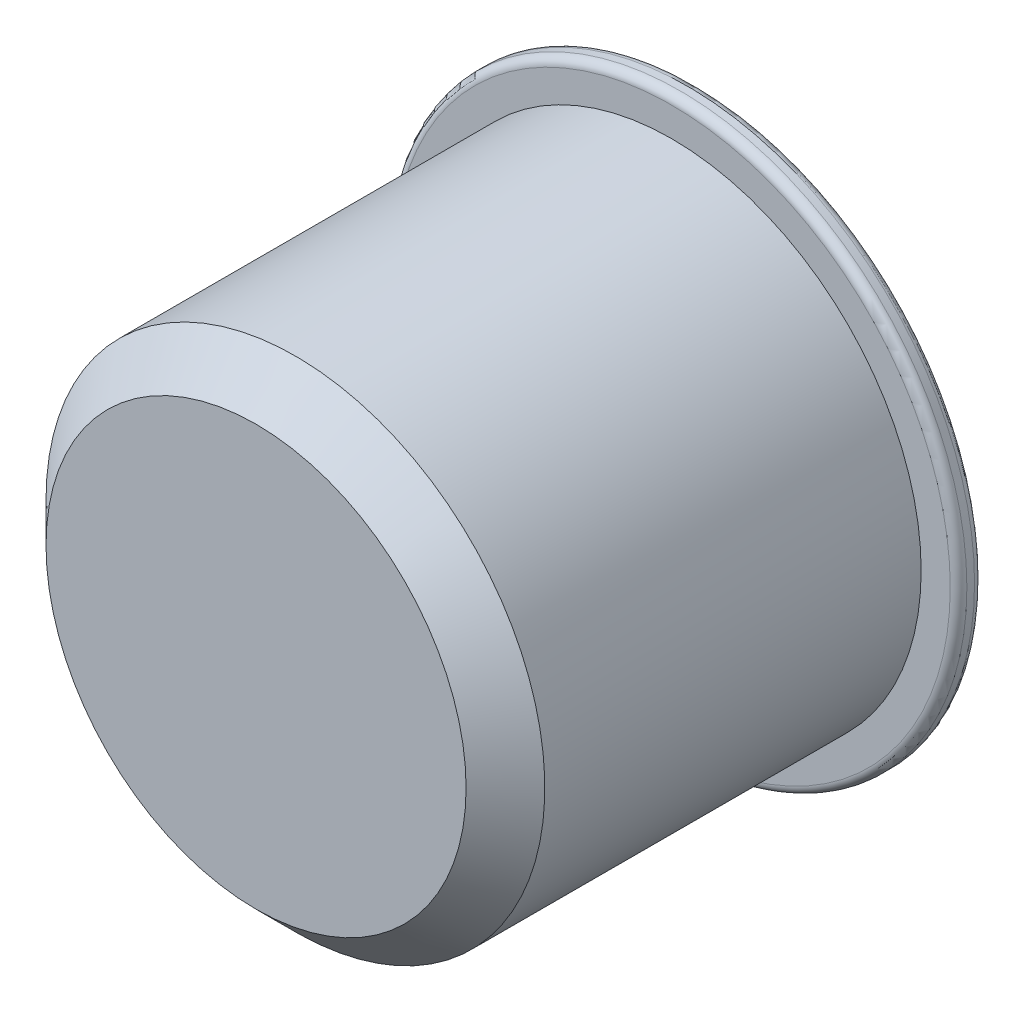
ISO-10303-21;
HEADER;
FILE_DESCRIPTION(('STEP AP214'),'2;1');
FILE_NAME('part.step','',(''),(''),'','','');
FILE_SCHEMA(('AUTOMOTIVE_DESIGN { 1 0 10303 214 1 1 1 1 }'));
ENDSEC;
DATA;
#1=APPLICATION_CONTEXT('core data for automotive mechanical design processes');
#2=APPLICATION_PROTOCOL_DEFINITION('international standard','automotive_design',2000,#1);
#3=PRODUCT_CONTEXT('',#1,'mechanical');
#4=PRODUCT('Part','Part','',(#3));
#5=PRODUCT_RELATED_PRODUCT_CATEGORY('part','',(#4));
#6=PRODUCT_DEFINITION_FORMATION('','',#4);
#7=PRODUCT_DEFINITION_CONTEXT('part definition',#1,'design');
#8=PRODUCT_DEFINITION('design','',#6,#7);
#9=PRODUCT_DEFINITION_SHAPE('','',#8);
#10=(LENGTH_UNIT() NAMED_UNIT(*) SI_UNIT(.MILLI.,.METRE.));
#11=(NAMED_UNIT(*) PLANE_ANGLE_UNIT() SI_UNIT($,.RADIAN.));
#12=(NAMED_UNIT(*) SI_UNIT($,.STERADIAN.) SOLID_ANGLE_UNIT());
#13=UNCERTAINTY_MEASURE_WITH_UNIT(LENGTH_MEASURE(1.E-05),#10,'distance_accuracy_value','');
#14=(GEOMETRIC_REPRESENTATION_CONTEXT(3) GLOBAL_UNCERTAINTY_ASSIGNED_CONTEXT((#13)) GLOBAL_UNIT_ASSIGNED_CONTEXT((#10,
#11,#12)) REPRESENTATION_CONTEXT('',''));
#15=CARTESIAN_POINT('',(0.,0.,0.));
#16=DIRECTION('',(0.,0.,1.));
#17=DIRECTION('',(1.,0.,0.));
#18=AXIS2_PLACEMENT_3D('',#15,#16,#17);
#19=CARTESIAN_POINT('',(0.,0.,1.6));
#20=DIRECTION('',(0.,0.,-1.));
#21=DIRECTION('',(-1.,0.,0.));
#22=AXIS2_PLACEMENT_3D('',#19,#20,#21);
#23=CYLINDRICAL_SURFACE('',#22,6.9);
#24=CARTESIAN_POINT('',(0.,0.,1.4));
#25=DIRECTION('',(0.,0.,1.));
#26=DIRECTION('',(1.,0.,0.));
#27=AXIS2_PLACEMENT_3D('',#24,#25,#26);
#28=CIRCLE('',#27,6.9);
#29=CARTESIAN_POINT('',(6.9,0.,1.4));
#30=VERTEX_POINT('',#29);
#31=EDGE_CURVE('E59',#30,#30,#28,.F.);
#32=ORIENTED_EDGE('',*,*,#31,.T.);
#33=EDGE_LOOP('',(#32));
#34=FACE_BOUND('',#33,.T.);
#35=CARTESIAN_POINT('',(0.,0.,1.21531050947474));
#36=DIRECTION('',(0.,0.,1.));
#37=DIRECTION('',(1.,0.,0.));
#38=AXIS2_PLACEMENT_3D('',#35,#36,#37);
#39=CIRCLE('',#38,6.9);
#40=CARTESIAN_POINT('',(6.9,0.,1.21531050947474));
#41=VERTEX_POINT('',#40);
#42=EDGE_CURVE('E308',#41,#41,#39,.T.);
#43=ORIENTED_EDGE('',*,*,#42,.T.);
#44=EDGE_LOOP('',(#43));
#45=FACE_BOUND('',#44,.T.);
#46=ADVANCED_FACE('F51',(#34,#45),#23,.T.);
#47=CARTESIAN_POINT('',(0.,0.,1.6));
#48=DIRECTION('',(0.,0.,1.));
#49=DIRECTION('',(1.,0.,0.));
#50=AXIS2_PLACEMENT_3D('',#47,#48,#49);
#51=PLANE('',#50);
#52=CARTESIAN_POINT('',(0.,0.,1.6));
#53=DIRECTION('',(0.,0.,1.));
#54=DIRECTION('',(1.,0.,0.));
#55=AXIS2_PLACEMENT_3D('',#52,#53,#54);
#56=CIRCLE('',#55,6.7);
#57=CARTESIAN_POINT('',(6.7,0.,1.6));
#58=VERTEX_POINT('',#57);
#59=EDGE_CURVE('E305',#58,#58,#56,.T.);
#60=ORIENTED_EDGE('',*,*,#59,.T.);
#61=EDGE_LOOP('',(#60));
#62=FACE_BOUND('',#61,.T.);
#63=CARTESIAN_POINT('',(0.,0.,1.6));
#64=DIRECTION('',(0.,0.,1.));
#65=DIRECTION('',(1.,0.,0.));
#66=AXIS2_PLACEMENT_3D('',#63,#64,#65);
#67=CIRCLE('',#66,6.);
#68=CARTESIAN_POINT('',(6.,0.,1.6));
#69=VERTEX_POINT('',#68);
#70=EDGE_CURVE('E288',#69,#69,#67,.T.);
#71=ORIENTED_EDGE('',*,*,#70,.F.);
#72=EDGE_LOOP('',(#71));
#73=FACE_BOUND('',#72,.T.);
#74=ADVANCED_FACE('F321',(#62,#73),#51,.T.);
#75=CARTESIAN_POINT('',(0.,0.,1.1));
#76=DIRECTION('',(0.,0.,1.));
#77=DIRECTION('',(1.,0.,0.));
#78=AXIS2_PLACEMENT_3D('',#75,#76,#77);
#79=CONICAL_SURFACE('',#78,6.9,1.04600055514479);
#80=CARTESIAN_POINT('',(0.,0.,1.04222525237851));
#81=DIRECTION('',(0.,0.,-1.));
#82=DIRECTION('',(-1.,0.,0.));
#83=AXIS2_PLACEMENT_3D('',#80,#81,#82);
#84=CIRCLE('',#83,6.80020725410834);
#85=CARTESIAN_POINT('',(-6.80020725410834,0.,1.04222525237851));
#86=VERTEX_POINT('',#85);
#87=EDGE_CURVE('E11',#86,#86,#84,.T.);
#88=ORIENTED_EDGE('',*,*,#87,.T.);
#89=EDGE_LOOP('',(#88));
#90=FACE_BOUND('',#89,.T.);
#91=CARTESIAN_POINT('',(0.,0.,0.));
#92=DIRECTION('',(0.,0.,-1.));
#93=DIRECTION('',(-1.,0.,0.));
#94=AXIS2_PLACEMENT_3D('',#91,#92,#93);
#95=CIRCLE('',#94,5.);
#96=CARTESIAN_POINT('',(-5.,0.,0.));
#97=VERTEX_POINT('',#96);
#98=EDGE_CURVE('E287',#97,#97,#95,.T.);
#99=ORIENTED_EDGE('',*,*,#98,.F.);
#100=EDGE_LOOP('',(#99));
#101=FACE_BOUND('',#100,.T.);
#102=ADVANCED_FACE('F324',(#90,#101),#79,.T.);
#103=CARTESIAN_POINT('',(0.,0.,0.));
#104=DIRECTION('',(0.,0.,1.));
#105=DIRECTION('',(1.,0.,0.));
#106=AXIS2_PLACEMENT_3D('',#103,#104,#105);
#107=PLANE('',#106);
#108=CARTESIAN_POINT('',(0.,0.,0.));
#109=DIRECTION('',(0.,0.,1.));
#110=DIRECTION('',(1.,0.,0.));
#111=AXIS2_PLACEMENT_3D('',#108,#109,#110);
#112=CIRCLE('',#111,4.6);
#113=CARTESIAN_POINT('',(4.6,0.,0.));
#114=VERTEX_POINT('',#113);
#115=EDGE_CURVE('E296',#114,#114,#112,.T.);
#116=ORIENTED_EDGE('',*,*,#115,.T.);
#117=EDGE_LOOP('',(#116));
#118=FACE_BOUND('',#117,.T.);
#119=ORIENTED_EDGE('',*,*,#98,.T.);
#120=EDGE_LOOP('',(#119));
#121=FACE_BOUND('',#120,.T.);
#122=ADVANCED_FACE('F331',(#118,#121),#107,.F.);
#123=CARTESIAN_POINT('',(0.,0.,11.6));
#124=DIRECTION('',(0.,0.,-1.));
#125=DIRECTION('',(-1.,0.,0.));
#126=AXIS2_PLACEMENT_3D('',#123,#124,#125);
#127=CYLINDRICAL_SURFACE('',#126,6.);
#128=CARTESIAN_POINT('',(0.,0.,10.653));
#129=DIRECTION('',(0.,0.,-1.));
#130=DIRECTION('',(-1.,0.,0.));
#131=AXIS2_PLACEMENT_3D('',#128,#129,#130);
#132=CIRCLE('',#131,6.);
#133=CARTESIAN_POINT('',(-6.,0.,10.653));
#134=VERTEX_POINT('',#133);
#135=EDGE_CURVE('E284',#134,#134,#132,.T.);
#136=ORIENTED_EDGE('',*,*,#135,.T.);
#137=EDGE_LOOP('',(#136));
#138=FACE_BOUND('',#137,.T.);
#139=ORIENTED_EDGE('',*,*,#70,.T.);
#140=EDGE_LOOP('',(#139));
#141=FACE_BOUND('',#140,.T.);
#142=ADVANCED_FACE('F328',(#138,#141),#127,.T.);
#143=CARTESIAN_POINT('',(0.,0.,11.6));
#144=DIRECTION('',(0.,0.,-1.));
#145=DIRECTION('',(-1.,0.,0.));
#146=AXIS2_PLACEMENT_3D('',#143,#144,#145);
#147=CONICAL_SURFACE('',#146,5.053,0.785398163397453);
#148=ORIENTED_EDGE('',*,*,#135,.F.);
#149=EDGE_LOOP('',(#148));
#150=FACE_BOUND('',#149,.T.);
#151=CARTESIAN_POINT('',(0.,0.,11.6));
#152=DIRECTION('',(0.,0.,-1.));
#153=DIRECTION('',(-1.,0.,0.));
#154=AXIS2_PLACEMENT_3D('',#151,#152,#153);
#155=CIRCLE('',#154,5.053);
#156=CARTESIAN_POINT('',(-5.053,0.,11.6));
#157=VERTEX_POINT('',#156);
#158=EDGE_CURVE('E281',#157,#157,#155,.T.);
#159=ORIENTED_EDGE('',*,*,#158,.T.);
#160=EDGE_LOOP('',(#159));
#161=FACE_BOUND('',#160,.T.);
#162=ADVANCED_FACE('F330',(#150,#161),#147,.T.);
#163=CARTESIAN_POINT('',(0.,0.,11.6));
#164=DIRECTION('',(0.,0.,1.));
#165=DIRECTION('',(1.,0.,0.));
#166=AXIS2_PLACEMENT_3D('',#163,#164,#165);
#167=PLANE('',#166);
#168=ORIENTED_EDGE('',*,*,#158,.F.);
#169=EDGE_LOOP('',(#168));
#170=FACE_BOUND('',#169,.T.);
#171=ADVANCED_FACE('F337',(#170),#167,.T.);
#172=CARTESIAN_POINT('',(0.,0.,0.5));
#173=DIRECTION('',(0.,0.,-1.));
#174=DIRECTION('',(-1.,0.,0.));
#175=AXIS2_PLACEMENT_3D('',#172,#173,#174);
#176=CYLINDRICAL_SURFACE('',#175,4.5);
#177=CARTESIAN_POINT('',(0.,0.,0.100000000000002));
#178=DIRECTION('',(0.,0.,1.));
#179=DIRECTION('',(1.,0.,0.));
#180=AXIS2_PLACEMENT_3D('',#177,#178,#179);
#181=CIRCLE('',#180,4.5);
#182=CARTESIAN_POINT('',(4.5,0.,0.100000000000002));
#183=VERTEX_POINT('',#182);
#184=EDGE_CURVE('E291',#183,#183,#181,.F.);
#185=ORIENTED_EDGE('',*,*,#184,.T.);
#186=EDGE_LOOP('',(#185));
#187=FACE_BOUND('',#186,.T.);
#188=CARTESIAN_POINT('',(0.,0.,0.5));
#189=DIRECTION('',(0.,0.,-1.));
#190=DIRECTION('',(-1.,0.,0.));
#191=AXIS2_PLACEMENT_3D('',#188,#189,#190);
#192=CIRCLE('',#191,4.5);
#193=CARTESIAN_POINT('',(-4.5,0.,0.5));
#194=VERTEX_POINT('',#193);
#195=EDGE_CURVE('E278',#194,#194,#192,.T.);
#196=ORIENTED_EDGE('',*,*,#195,.F.);
#197=EDGE_LOOP('',(#196));
#198=FACE_BOUND('',#197,.T.);
#199=ADVANCED_FACE('F385',(#187,#198),#176,.F.);
#200=CARTESIAN_POINT('',(0.,0.,0.5));
#201=DIRECTION('',(0.,0.,-1.));
#202=DIRECTION('',(-1.,0.,0.));
#203=AXIS2_PLACEMENT_3D('',#200,#201,#202);
#204=PLANE('',#203);
#205=CARTESIAN_POINT('',(0.,0.,0.5));
#206=DIRECTION('',(0.,0.,-1.));
#207=DIRECTION('',(-1.,0.,0.));
#208=AXIS2_PLACEMENT_3D('',#205,#206,#207);
#209=CIRCLE('',#208,3.5);
#210=CARTESIAN_POINT('',(-3.5,0.,0.5));
#211=VERTEX_POINT('',#210);
#212=EDGE_CURVE('E262',#211,#211,#209,.T.);
#213=ORIENTED_EDGE('',*,*,#212,.F.);
#214=EDGE_LOOP('',(#213));
#215=FACE_BOUND('',#214,.T.);
#216=ORIENTED_EDGE('',*,*,#195,.T.);
#217=EDGE_LOOP('',(#216));
#218=FACE_BOUND('',#217,.T.);
#219=ADVANCED_FACE('F378',(#215,#218),#204,.T.);
#220=CARTESIAN_POINT('',(0.,0.,0.5));
#221=DIRECTION('',(0.,0.,-1.));
#222=DIRECTION('',(-1.,0.,0.));
#223=AXIS2_PLACEMENT_3D('',#220,#221,#222);
#224=CYLINDRICAL_SURFACE('',#223,3.5);
#225=CARTESIAN_POINT('',(0.,0.,0.0999999999999977));
#226=DIRECTION('',(0.,0.,1.));
#227=DIRECTION('',(1.,0.,0.));
#228=AXIS2_PLACEMENT_3D('',#225,#226,#227);
#229=CIRCLE('',#228,3.5);
#230=CARTESIAN_POINT('',(3.5,0.,0.0999999999999977));
#231=VERTEX_POINT('',#230);
#232=EDGE_CURVE('E302',#231,#231,#229,.T.);
#233=ORIENTED_EDGE('',*,*,#232,.T.);
#234=EDGE_LOOP('',(#233));
#235=FACE_BOUND('',#234,.T.);
#236=ORIENTED_EDGE('',*,*,#212,.T.);
#237=EDGE_LOOP('',(#236));
#238=FACE_BOUND('',#237,.T.);
#239=ADVANCED_FACE('F371',(#235,#238),#224,.T.);
#240=CARTESIAN_POINT('',(0.,0.,0.));
#241=DIRECTION('',(0.,0.,1.));
#242=DIRECTION('',(1.,0.,0.));
#243=AXIS2_PLACEMENT_3D('',#240,#241,#242);
#244=CIRCLE('',#243,3.4);
#245=CARTESIAN_POINT('',(3.4,0.,0.));
#246=VERTEX_POINT('',#245);
#247=EDGE_CURVE('E299',#246,#246,#244,.F.);
#248=ORIENTED_EDGE('',*,*,#247,.T.);
#249=EDGE_LOOP('',(#248));
#250=FACE_BOUND('',#249,.T.);
#251=DIRECTION('',(0.584534969072463,-0.811368516724339,0.));
#252=VECTOR('',#251,1.);
#253=CARTESIAN_POINT('',(-1.32058244355751,1.83304519854762,0.));
#254=LINE('',#253,#252);
#255=CARTESIAN_POINT('',(-1.37925483630834,1.9144858903756,0.));
#256=VERTEX_POINT('',#255);
#257=CARTESIAN_POINT('',(-1.32058244355751,1.83304519854762,0.));
#258=VERTEX_POINT('',#257);
#259=EDGE_CURVE('E185',#256,#258,#254,.T.);
#260=ORIENTED_EDGE('',*,*,#259,.F.);
#261=CARTESIAN_POINT('',(-1.5415285396532,1.7975788965611,0.));
#262=DIRECTION('',(0.,0.,-1.));
#263=DIRECTION('',(1.,0.,0.));
#264=AXIS2_PLACEMENT_3D('',#261,#262,#263);
#265=CIRCLE('',#264,0.200000000000001);
#266=CARTESIAN_POINT('',(-1.67172316217779,1.9493990542006,0.));
#267=VERTEX_POINT('',#266);
#268=EDGE_CURVE('E66',#267,#256,#265,.T.);
#269=ORIENTED_EDGE('',*,*,#268,.F.);
#270=CARTESIAN_POINT('',(0.,0.,0.));
#271=DIRECTION('',(0.,0.,-1.));
#272=DIRECTION('',(-1.,0.,0.));
#273=AXIS2_PLACEMENT_3D('',#270,#271,#272);
#274=CIRCLE('',#273,2.56803718888179);
#275=CARTESIAN_POINT('',(1.67172316217779,1.9493990542006,0.));
#276=VERTEX_POINT('',#275);
#277=EDGE_CURVE('E173',#276,#267,#274,.T.);
#278=ORIENTED_EDGE('',*,*,#277,.F.);
#279=CARTESIAN_POINT('',(1.5415285396532,1.7975788965611,0.));
#280=DIRECTION('',(0.,0.,-1.));
#281=DIRECTION('',(-1.,0.,0.));
#282=AXIS2_PLACEMENT_3D('',#279,#280,#281);
#283=CIRCLE('',#282,0.2);
#284=CARTESIAN_POINT('',(1.37925483630834,1.9144858903756,0.));
#285=VERTEX_POINT('',#284);
#286=EDGE_CURVE('E178',#285,#276,#283,.T.);
#287=ORIENTED_EDGE('',*,*,#286,.F.);
#288=DIRECTION('',(0.584534969072464,0.811368516724339,0.));
#289=VECTOR('',#288,1.);
#290=CARTESIAN_POINT('',(1.32058244355751,1.83304519854762,0.));
#291=LINE('',#290,#289);
#292=CARTESIAN_POINT('',(1.32058244355751,1.83304519854762,0.));
#293=VERTEX_POINT('',#292);
#294=EDGE_CURVE('E672',#293,#285,#291,.T.);
#295=ORIENTED_EDGE('',*,*,#294,.F.);
#296=CARTESIAN_POINT('',(1.48285614690238,1.71613820473313,0.));
#297=DIRECTION('',(0.,0.,-1.));
#298=DIRECTION('',(-1.,0.,0.));
#299=AXIS2_PLACEMENT_3D('',#296,#297,#298);
#300=CIRCLE('',#299,0.2);
#301=CARTESIAN_POINT('',(1.35209496237053,1.56480574747486,0.));
#302=VERTEX_POINT('',#301);
#303=EDGE_CURVE('E674',#302,#293,#300,.T.);
#304=ORIENTED_EDGE('',*,*,#303,.F.);
#305=CARTESIAN_POINT('',(0.,0.,0.));
#306=DIRECTION('',(0.,0.,1.));
#307=DIRECTION('',(-1.,0.,0.));
#308=AXIS2_PLACEMENT_3D('',#305,#306,#307);
#309=CIRCLE('',#308,2.06803718888179);
#310=CARTESIAN_POINT('',(-1.35209496237053,1.56480574747486,0.));
#311=VERTEX_POINT('',#310);
#312=EDGE_CURVE('E677',#311,#302,#309,.T.);
#313=ORIENTED_EDGE('',*,*,#312,.F.);
#314=CARTESIAN_POINT('',(-1.48285614690238,1.71613820473313,0.));
#315=DIRECTION('',(0.,0.,-1.));
#316=DIRECTION('',(1.,0.,0.));
#317=AXIS2_PLACEMENT_3D('',#314,#315,#316);
#318=CIRCLE('',#317,0.2);
#319=EDGE_CURVE('E189',#258,#311,#318,.T.);
#320=ORIENTED_EDGE('',*,*,#319,.F.);
#321=EDGE_LOOP('',(#260,#269,#278,#287,#295,#304,#313,#320));
#322=FACE_BOUND('',#321,.T.);
#323=DIRECTION('',(1.,0.,0.));
#324=VECTOR('',#323,1.);
#325=CARTESIAN_POINT('',(-0.0501872393057397,2.75880472339706,0.));
#326=LINE('',#325,#324);
#327=CARTESIAN_POINT('',(-0.0501872393057397,2.75880472339706,0.));
#328=VERTEX_POINT('',#327);
#329=CARTESIAN_POINT('',(0.0501872393057394,2.75880472339706,0.));
#330=VERTEX_POINT('',#329);
#331=EDGE_CURVE('E187',#328,#330,#326,.T.);
#332=ORIENTED_EDGE('',*,*,#331,.F.);
#333=CARTESIAN_POINT('',(-0.0501872393057397,2.55880472339706,0.));
#334=DIRECTION('',(0.,0.,-1.));
#335=DIRECTION('',(-1.,0.,0.));
#336=AXIS2_PLACEMENT_3D('',#333,#334,#335);
#337=CIRCLE('',#336,0.2);
#338=CARTESIAN_POINT('',(-0.25018723930574,2.55880472339706,0.));
#339=VERTEX_POINT('',#338);
#340=EDGE_CURVE('E74',#339,#328,#337,.T.);
#341=ORIENTED_EDGE('',*,*,#340,.F.);
#342=DIRECTION('',(0.,1.,0.));
#343=VECTOR('',#342,1.);
#344=CARTESIAN_POINT('',(-0.25018723930574,1.48079356072704,0.));
#345=LINE('',#344,#343);
#346=CARTESIAN_POINT('',(-0.25018723930574,1.48079356072704,0.));
#347=VERTEX_POINT('',#346);
#348=EDGE_CURVE('E219',#347,#339,#345,.T.);
#349=ORIENTED_EDGE('',*,*,#348,.F.);
#350=CARTESIAN_POINT('',(-0.0501872393057397,1.48079356072704,0.));
#351=DIRECTION('',(0.,0.,-1.));
#352=DIRECTION('',(-1.,0.,0.));
#353=AXIS2_PLACEMENT_3D('',#350,#351,#352);
#354=CIRCLE('',#353,0.2);
#355=CARTESIAN_POINT('',(-0.0501872393057397,1.28079356072704,0.));
#356=VERTEX_POINT('',#355);
#357=EDGE_CURVE('E255',#356,#347,#354,.T.);
#358=ORIENTED_EDGE('',*,*,#357,.F.);
#359=DIRECTION('',(-1.,0.,0.));
#360=VECTOR('',#359,1.);
#361=CARTESIAN_POINT('',(0.0501872393057391,1.28079356072704,0.));
#362=LINE('',#361,#360);
#363=CARTESIAN_POINT('',(0.0501872393057391,1.28079356072704,0.));
#364=VERTEX_POINT('',#363);
#365=EDGE_CURVE('E252',#364,#356,#362,.T.);
#366=ORIENTED_EDGE('',*,*,#365,.F.);
#367=CARTESIAN_POINT('',(0.0501872393057391,1.48079356072704,0.));
#368=DIRECTION('',(0.,0.,-1.));
#369=DIRECTION('',(-1.,0.,0.));
#370=AXIS2_PLACEMENT_3D('',#367,#368,#369);
#371=CIRCLE('',#370,0.2);
#372=CARTESIAN_POINT('',(0.250187239305739,1.48079356072704,0.));
#373=VERTEX_POINT('',#372);
#374=EDGE_CURVE('E249',#373,#364,#371,.T.);
#375=ORIENTED_EDGE('',*,*,#374,.F.);
#376=DIRECTION('',(0.,-1.,0.));
#377=VECTOR('',#376,1.);
#378=CARTESIAN_POINT('',(0.250187239305739,1.48079356072704,0.));
#379=LINE('',#378,#377);
#380=CARTESIAN_POINT('',(0.250187239305739,2.55880472339706,0.));
#381=VERTEX_POINT('',#380);
#382=EDGE_CURVE('E246',#381,#373,#379,.T.);
#383=ORIENTED_EDGE('',*,*,#382,.F.);
#384=CARTESIAN_POINT('',(0.0501872393057393,2.55880472339706,0.));
#385=DIRECTION('',(0.,0.,-1.));
#386=DIRECTION('',(1.,0.,0.));
#387=AXIS2_PLACEMENT_3D('',#384,#385,#386);
#388=CIRCLE('',#387,0.2);
#389=EDGE_CURVE('E243',#330,#381,#388,.T.);
#390=ORIENTED_EDGE('',*,*,#389,.F.);
#391=EDGE_LOOP('',(#332,#341,#349,#358,#366,#375,#383,#390));
#392=FACE_BOUND('',#391,.T.);
#393=ADVANCED_FACE('F181',(#250,#322,#392),#107,.F.);
#394=CARTESIAN_POINT('',(-0.0501872393057397,2.55880472339706,0.2));
#395=DIRECTION('',(0.,0.,-1.));
#396=DIRECTION('',(-1.,0.,0.));
#397=AXIS2_PLACEMENT_3D('',#394,#395,#396);
#398=CYLINDRICAL_SURFACE('',#397,0.2);
#399=ORIENTED_EDGE('',*,*,#340,.T.);
#400=DIRECTION('',(0.,0.,-1.));
#401=VECTOR('',#400,1.);
#402=CARTESIAN_POINT('',(-0.0501872393057397,2.75880472339706,0.2));
#403=LINE('',#402,#401);
#404=CARTESIAN_POINT('',(-0.0501872393057397,2.75880472339706,0.2));
#405=VERTEX_POINT('',#404);
#406=EDGE_CURVE('E239',#405,#328,#403,.T.);
#407=ORIENTED_EDGE('',*,*,#406,.F.);
#408=CARTESIAN_POINT('',(-0.0501872393057397,2.55880472339706,0.2));
#409=DIRECTION('',(0.,0.,-1.));
#410=DIRECTION('',(-1.,0.,0.));
#411=AXIS2_PLACEMENT_3D('',#408,#409,#410);
#412=CIRCLE('',#411,0.2);
#413=CARTESIAN_POINT('',(-0.25018723930574,2.55880472339706,0.2));
#414=VERTEX_POINT('',#413);
#415=EDGE_CURVE('E215',#414,#405,#412,.T.);
#416=ORIENTED_EDGE('',*,*,#415,.F.);
#417=DIRECTION('',(0.,0.,-1.));
#418=VECTOR('',#417,1.);
#419=CARTESIAN_POINT('',(-0.25018723930574,2.55880472339706,0.2));
#420=LINE('',#419,#418);
#421=EDGE_CURVE('E260',#414,#339,#420,.T.);
#422=ORIENTED_EDGE('',*,*,#421,.T.);
#423=EDGE_LOOP('',(#399,#407,#416,#422));
#424=FACE_BOUND('',#423,.T.);
#425=ADVANCED_FACE('F370',(#424),#398,.F.);
#426=CARTESIAN_POINT('',(-0.25018723930574,1.48079356072704,0.2));
#427=DIRECTION('',(-1.,0.,0.));
#428=DIRECTION('',(0.,0.,1.));
#429=AXIS2_PLACEMENT_3D('',#426,#427,#428);
#430=PLANE('',#429);
#431=ORIENTED_EDGE('',*,*,#348,.T.);
#432=ORIENTED_EDGE('',*,*,#421,.F.);
#433=DIRECTION('',(0.,1.,0.));
#434=VECTOR('',#433,1.);
#435=CARTESIAN_POINT('',(-0.25018723930574,1.48079356072704,0.2));
#436=LINE('',#435,#434);
#437=CARTESIAN_POINT('',(-0.25018723930574,1.48079356072704,0.2));
#438=VERTEX_POINT('',#437);
#439=EDGE_CURVE('E237',#438,#414,#436,.T.);
#440=ORIENTED_EDGE('',*,*,#439,.F.);
#441=DIRECTION('',(0.,0.,-1.));
#442=VECTOR('',#441,1.);
#443=CARTESIAN_POINT('',(-0.25018723930574,1.48079356072704,0.2));
#444=LINE('',#443,#442);
#445=EDGE_CURVE('E263',#438,#347,#444,.T.);
#446=ORIENTED_EDGE('',*,*,#445,.T.);
#447=EDGE_LOOP('',(#431,#432,#440,#446));
#448=FACE_BOUND('',#447,.T.);
#449=ADVANCED_FACE('F376',(#448),#430,.F.);
#450=CARTESIAN_POINT('',(-0.0501872393057397,1.48079356072704,0.2));
#451=DIRECTION('',(0.,0.,-1.));
#452=DIRECTION('',(-1.,0.,0.));
#453=AXIS2_PLACEMENT_3D('',#450,#451,#452);
#454=CYLINDRICAL_SURFACE('',#453,0.2);
#455=ORIENTED_EDGE('',*,*,#357,.T.);
#456=ORIENTED_EDGE('',*,*,#445,.F.);
#457=CARTESIAN_POINT('',(-0.0501872393057397,1.48079356072704,0.2));
#458=DIRECTION('',(0.,0.,-1.));
#459=DIRECTION('',(-1.,0.,0.));
#460=AXIS2_PLACEMENT_3D('',#457,#458,#459);
#461=CIRCLE('',#460,0.2);
#462=CARTESIAN_POINT('',(-0.0501872393057397,1.28079356072704,0.2));
#463=VERTEX_POINT('',#462);
#464=EDGE_CURVE('E234',#463,#438,#461,.T.);
#465=ORIENTED_EDGE('',*,*,#464,.F.);
#466=DIRECTION('',(0.,0.,-1.));
#467=VECTOR('',#466,1.);
#468=CARTESIAN_POINT('',(-0.0501872393057397,1.28079356072704,0.2));
#469=LINE('',#468,#467);
#470=EDGE_CURVE('E265',#463,#356,#469,.T.);
#471=ORIENTED_EDGE('',*,*,#470,.T.);
#472=EDGE_LOOP('',(#455,#456,#465,#471));
#473=FACE_BOUND('',#472,.T.);
#474=ADVANCED_FACE('F420',(#473),#454,.F.);
#475=CARTESIAN_POINT('',(0.0501872393057391,1.28079356072704,0.2));
#476=DIRECTION('',(0.,-1.,0.));
#477=DIRECTION('',(0.,0.,-1.));
#478=AXIS2_PLACEMENT_3D('',#475,#476,#477);
#479=PLANE('',#478);
#480=ORIENTED_EDGE('',*,*,#365,.T.);
#481=ORIENTED_EDGE('',*,*,#470,.F.);
#482=DIRECTION('',(-1.,0.,0.));
#483=VECTOR('',#482,1.);
#484=CARTESIAN_POINT('',(0.0501872393057391,1.28079356072704,0.2));
#485=LINE('',#484,#483);
#486=CARTESIAN_POINT('',(0.0501872393057391,1.28079356072704,0.2));
#487=VERTEX_POINT('',#486);
#488=EDGE_CURVE('E231',#487,#463,#485,.T.);
#489=ORIENTED_EDGE('',*,*,#488,.F.);
#490=DIRECTION('',(0.,0.,-1.));
#491=VECTOR('',#490,1.);
#492=CARTESIAN_POINT('',(0.0501872393057391,1.28079356072704,0.2));
#493=LINE('',#492,#491);
#494=EDGE_CURVE('E267',#487,#364,#493,.T.);
#495=ORIENTED_EDGE('',*,*,#494,.T.);
#496=EDGE_LOOP('',(#480,#481,#489,#495));
#497=FACE_BOUND('',#496,.T.);
#498=ADVANCED_FACE('F429',(#497),#479,.F.);
#499=CARTESIAN_POINT('',(0.0501872393057391,1.48079356072704,0.2));
#500=DIRECTION('',(0.,0.,-1.));
#501=DIRECTION('',(-1.,0.,0.));
#502=AXIS2_PLACEMENT_3D('',#499,#500,#501);
#503=CYLINDRICAL_SURFACE('',#502,0.2);
#504=ORIENTED_EDGE('',*,*,#374,.T.);
#505=ORIENTED_EDGE('',*,*,#494,.F.);
#506=CARTESIAN_POINT('',(0.0501872393057391,1.48079356072704,0.2));
#507=DIRECTION('',(0.,0.,-1.));
#508=DIRECTION('',(-1.,0.,0.));
#509=AXIS2_PLACEMENT_3D('',#506,#507,#508);
#510=CIRCLE('',#509,0.2);
#511=CARTESIAN_POINT('',(0.250187239305739,1.48079356072704,0.2));
#512=VERTEX_POINT('',#511);
#513=EDGE_CURVE('E228',#512,#487,#510,.T.);
#514=ORIENTED_EDGE('',*,*,#513,.F.);
#515=DIRECTION('',(0.,0.,-1.));
#516=VECTOR('',#515,1.);
#517=CARTESIAN_POINT('',(0.250187239305739,1.48079356072704,0.2));
#518=LINE('',#517,#516);
#519=EDGE_CURVE('E269',#512,#373,#518,.T.);
#520=ORIENTED_EDGE('',*,*,#519,.T.);
#521=EDGE_LOOP('',(#504,#505,#514,#520));
#522=FACE_BOUND('',#521,.T.);
#523=ADVANCED_FACE('F438',(#522),#503,.F.);
#524=CARTESIAN_POINT('',(0.250187239305739,1.48079356072704,0.2));
#525=DIRECTION('',(1.,0.,0.));
#526=DIRECTION('',(0.,1.,0.));
#527=AXIS2_PLACEMENT_3D('',#524,#525,#526);
#528=PLANE('',#527);
#529=ORIENTED_EDGE('',*,*,#382,.T.);
#530=ORIENTED_EDGE('',*,*,#519,.F.);
#531=DIRECTION('',(0.,-1.,0.));
#532=VECTOR('',#531,1.);
#533=CARTESIAN_POINT('',(0.250187239305739,1.48079356072704,0.2));
#534=LINE('',#533,#532);
#535=CARTESIAN_POINT('',(0.250187239305739,2.55880472339706,0.2));
#536=VERTEX_POINT('',#535);
#537=EDGE_CURVE('E225',#536,#512,#534,.T.);
#538=ORIENTED_EDGE('',*,*,#537,.F.);
#539=DIRECTION('',(0.,0.,-1.));
#540=VECTOR('',#539,1.);
#541=CARTESIAN_POINT('',(0.250187239305739,2.55880472339706,0.2));
#542=LINE('',#541,#540);
#543=EDGE_CURVE('E271',#536,#381,#542,.T.);
#544=ORIENTED_EDGE('',*,*,#543,.T.);
#545=EDGE_LOOP('',(#529,#530,#538,#544));
#546=FACE_BOUND('',#545,.T.);
#547=ADVANCED_FACE('F447',(#546),#528,.F.);
#548=CARTESIAN_POINT('',(0.0501872393057393,2.55880472339706,0.2));
#549=DIRECTION('',(0.,0.,-1.));
#550=DIRECTION('',(-1.,0.,0.));
#551=AXIS2_PLACEMENT_3D('',#548,#549,#550);
#552=CYLINDRICAL_SURFACE('',#551,0.2);
#553=ORIENTED_EDGE('',*,*,#389,.T.);
#554=ORIENTED_EDGE('',*,*,#543,.F.);
#555=CARTESIAN_POINT('',(0.0501872393057393,2.55880472339706,0.2));
#556=DIRECTION('',(0.,0.,-1.));
#557=DIRECTION('',(1.,0.,0.));
#558=AXIS2_PLACEMENT_3D('',#555,#556,#557);
#559=CIRCLE('',#558,0.2);
#560=CARTESIAN_POINT('',(0.0501872393057394,2.75880472339706,0.2));
#561=VERTEX_POINT('',#560);
#562=EDGE_CURVE('E222',#561,#536,#559,.T.);
#563=ORIENTED_EDGE('',*,*,#562,.F.);
#564=DIRECTION('',(0.,0.,-1.));
#565=VECTOR('',#564,1.);
#566=CARTESIAN_POINT('',(0.0501872393057394,2.75880472339706,0.2));
#567=LINE('',#566,#565);
#568=EDGE_CURVE('E273',#561,#330,#567,.T.);
#569=ORIENTED_EDGE('',*,*,#568,.T.);
#570=EDGE_LOOP('',(#553,#554,#563,#569));
#571=FACE_BOUND('',#570,.T.);
#572=ADVANCED_FACE('F456',(#571),#552,.F.);
#573=CARTESIAN_POINT('',(-0.0501872393057397,2.75880472339706,0.2));
#574=DIRECTION('',(0.,1.,0.));
#575=DIRECTION('',(0.,0.,1.));
#576=AXIS2_PLACEMENT_3D('',#573,#574,#575);
#577=PLANE('',#576);
#578=ORIENTED_EDGE('',*,*,#331,.T.);
#579=ORIENTED_EDGE('',*,*,#568,.F.);
#580=DIRECTION('',(1.,0.,0.));
#581=VECTOR('',#580,1.);
#582=CARTESIAN_POINT('',(-0.0501872393057397,2.75880472339706,0.2));
#583=LINE('',#582,#581);
#584=EDGE_CURVE('E218',#405,#561,#583,.T.);
#585=ORIENTED_EDGE('',*,*,#584,.F.);
#586=ORIENTED_EDGE('',*,*,#406,.T.);
#587=EDGE_LOOP('',(#578,#579,#585,#586));
#588=FACE_BOUND('',#587,.T.);
#589=ADVANCED_FACE('F465',(#588),#577,.F.);
#590=CARTESIAN_POINT('',(-0.0501872393057397,2.55880472339706,0.2));
#591=DIRECTION('',(0.,0.,-1.));
#592=DIRECTION('',(-1.,0.,0.));
#593=AXIS2_PLACEMENT_3D('',#590,#591,#592);
#594=PLANE('',#593);
#595=ORIENTED_EDGE('',*,*,#415,.T.);
#596=ORIENTED_EDGE('',*,*,#584,.T.);
#597=ORIENTED_EDGE('',*,*,#562,.T.);
#598=ORIENTED_EDGE('',*,*,#537,.T.);
#599=ORIENTED_EDGE('',*,*,#513,.T.);
#600=ORIENTED_EDGE('',*,*,#488,.T.);
#601=ORIENTED_EDGE('',*,*,#464,.T.);
#602=ORIENTED_EDGE('',*,*,#439,.T.);
#603=EDGE_LOOP('',(#595,#596,#597,#598,#599,#600,#601,#602));
#604=FACE_BOUND('',#603,.T.);
#605=ADVANCED_FACE('F474',(#604),#594,.T.);
#606=CARTESIAN_POINT('',(-1.5415285396532,1.7975788965611,0.2));
#607=DIRECTION('',(0.,0.,-1.));
#608=DIRECTION('',(-1.,0.,0.));
#609=AXIS2_PLACEMENT_3D('',#606,#607,#608);
#610=CYLINDRICAL_SURFACE('',#609,0.200000000000001);
#611=ORIENTED_EDGE('',*,*,#268,.T.);
#612=DIRECTION('',(0.,0.,-1.));
#613=VECTOR('',#612,1.);
#614=CARTESIAN_POINT('',(-1.37925483630834,1.9144858903756,0.2));
#615=LINE('',#614,#613);
#616=CARTESIAN_POINT('',(-1.37925483630834,1.9144858903756,0.2));
#617=VERTEX_POINT('',#616);
#618=EDGE_CURVE('E196',#617,#256,#615,.T.);
#619=ORIENTED_EDGE('',*,*,#618,.F.);
#620=CARTESIAN_POINT('',(-1.5415285396532,1.7975788965611,0.2));
#621=DIRECTION('',(0.,0.,-1.));
#622=DIRECTION('',(1.,0.,0.));
#623=AXIS2_PLACEMENT_3D('',#620,#621,#622);
#624=CIRCLE('',#623,0.200000000000001);
#625=CARTESIAN_POINT('',(-1.67172316217779,1.9493990542006,0.2));
#626=VERTEX_POINT('',#625);
#627=EDGE_CURVE('E166',#626,#617,#624,.T.);
#628=ORIENTED_EDGE('',*,*,#627,.F.);
#629=DIRECTION('',(0.,0.,-1.));
#630=VECTOR('',#629,1.);
#631=CARTESIAN_POINT('',(-1.67172316217779,1.9493990542006,0.2));
#632=LINE('',#631,#630);
#633=EDGE_CURVE('E162',#626,#267,#632,.T.);
#634=ORIENTED_EDGE('',*,*,#633,.T.);
#635=EDGE_LOOP('',(#611,#619,#628,#634));
#636=FACE_BOUND('',#635,.T.);
#637=ADVANCED_FACE('F164',(#636),#610,.F.);
#638=CARTESIAN_POINT('',(0.,0.,0.2));
#639=DIRECTION('',(0.,0.,-1.));
#640=DIRECTION('',(-1.,0.,0.));
#641=AXIS2_PLACEMENT_3D('',#638,#639,#640);
#642=CYLINDRICAL_SURFACE('',#641,2.56803718888179);
#643=ORIENTED_EDGE('',*,*,#277,.T.);
#644=ORIENTED_EDGE('',*,*,#633,.F.);
#645=CARTESIAN_POINT('',(0.,0.,0.2));
#646=DIRECTION('',(0.,0.,-1.));
#647=DIRECTION('',(-1.,0.,0.));
#648=AXIS2_PLACEMENT_3D('',#645,#646,#647);
#649=CIRCLE('',#648,2.56803718888179);
#650=CARTESIAN_POINT('',(1.67172316217779,1.9493990542006,0.2));
#651=VERTEX_POINT('',#650);
#652=EDGE_CURVE('E193',#651,#626,#649,.T.);
#653=ORIENTED_EDGE('',*,*,#652,.F.);
#654=DIRECTION('',(0.,0.,-1.));
#655=VECTOR('',#654,1.);
#656=CARTESIAN_POINT('',(1.67172316217779,1.9493990542006,0.2));
#657=LINE('',#656,#655);
#658=EDGE_CURVE('E170',#651,#276,#657,.T.);
#659=ORIENTED_EDGE('',*,*,#658,.T.);
#660=EDGE_LOOP('',(#643,#644,#653,#659));
#661=FACE_BOUND('',#660,.T.);
#662=ADVANCED_FACE('F174',(#661),#642,.F.);
#663=CARTESIAN_POINT('',(1.5415285396532,1.7975788965611,0.2));
#664=DIRECTION('',(0.,0.,-1.));
#665=DIRECTION('',(-1.,0.,0.));
#666=AXIS2_PLACEMENT_3D('',#663,#664,#665);
#667=CYLINDRICAL_SURFACE('',#666,0.2);
#668=ORIENTED_EDGE('',*,*,#286,.T.);
#669=ORIENTED_EDGE('',*,*,#658,.F.);
#670=CARTESIAN_POINT('',(1.5415285396532,1.7975788965611,0.2));
#671=DIRECTION('',(0.,0.,-1.));
#672=DIRECTION('',(-1.,0.,0.));
#673=AXIS2_PLACEMENT_3D('',#670,#671,#672);
#674=CIRCLE('',#673,0.2);
#675=CARTESIAN_POINT('',(1.37925483630834,1.9144858903756,0.2));
#676=VERTEX_POINT('',#675);
#677=EDGE_CURVE('E195',#676,#651,#674,.T.);
#678=ORIENTED_EDGE('',*,*,#677,.F.);
#679=DIRECTION('',(0.,0.,-1.));
#680=VECTOR('',#679,1.);
#681=CARTESIAN_POINT('',(1.37925483630834,1.9144858903756,0.2));
#682=LINE('',#681,#680);
#683=EDGE_CURVE('E664',#676,#285,#682,.T.);
#684=ORIENTED_EDGE('',*,*,#683,.T.);
#685=EDGE_LOOP('',(#668,#669,#678,#684));
#686=FACE_BOUND('',#685,.T.);
#687=ADVANCED_FACE('F497',(#686),#667,.F.);
#688=CARTESIAN_POINT('',(1.32058244355751,1.83304519854762,0.2));
#689=DIRECTION('',(-0.811368516724339,0.584534969072463,0.));
#690=DIRECTION('',(-0.584534969072464,-0.811368516724339,0.));
#691=AXIS2_PLACEMENT_3D('',#688,#689,#690);
#692=PLANE('',#691);
#693=ORIENTED_EDGE('',*,*,#294,.T.);
#694=ORIENTED_EDGE('',*,*,#683,.F.);
#695=DIRECTION('',(0.584534969072464,0.811368516724339,0.));
#696=VECTOR('',#695,1.);
#697=CARTESIAN_POINT('',(1.32058244355751,1.83304519854762,0.2));
#698=LINE('',#697,#696);
#699=CARTESIAN_POINT('',(1.32058244355751,1.83304519854762,0.2));
#700=VERTEX_POINT('',#699);
#701=EDGE_CURVE('E199',#700,#676,#698,.T.);
#702=ORIENTED_EDGE('',*,*,#701,.F.);
#703=DIRECTION('',(0.,0.,-1.));
#704=VECTOR('',#703,1.);
#705=CARTESIAN_POINT('',(1.32058244355751,1.83304519854762,0.2));
#706=LINE('',#705,#704);
#707=EDGE_CURVE('E667',#700,#293,#706,.T.);
#708=ORIENTED_EDGE('',*,*,#707,.T.);
#709=EDGE_LOOP('',(#693,#694,#702,#708));
#710=FACE_BOUND('',#709,.T.);
#711=ADVANCED_FACE('F505',(#710),#692,.F.);
#712=CARTESIAN_POINT('',(1.48285614690238,1.71613820473313,0.2));
#713=DIRECTION('',(0.,0.,-1.));
#714=DIRECTION('',(-1.,0.,0.));
#715=AXIS2_PLACEMENT_3D('',#712,#713,#714);
#716=CYLINDRICAL_SURFACE('',#715,0.2);
#717=ORIENTED_EDGE('',*,*,#303,.T.);
#718=ORIENTED_EDGE('',*,*,#707,.F.);
#719=CARTESIAN_POINT('',(1.48285614690238,1.71613820473313,0.2));
#720=DIRECTION('',(0.,0.,-1.));
#721=DIRECTION('',(-1.,0.,0.));
#722=AXIS2_PLACEMENT_3D('',#719,#720,#721);
#723=CIRCLE('',#722,0.2);
#724=CARTESIAN_POINT('',(1.35209496237053,1.56480574747486,0.2));
#725=VERTEX_POINT('',#724);
#726=EDGE_CURVE('E202',#725,#700,#723,.T.);
#727=ORIENTED_EDGE('',*,*,#726,.F.);
#728=DIRECTION('',(0.,0.,-1.));
#729=VECTOR('',#728,1.);
#730=CARTESIAN_POINT('',(1.35209496237053,1.56480574747486,0.2));
#731=LINE('',#730,#729);
#732=EDGE_CURVE('E687',#725,#302,#731,.T.);
#733=ORIENTED_EDGE('',*,*,#732,.T.);
#734=EDGE_LOOP('',(#717,#718,#727,#733));
#735=FACE_BOUND('',#734,.T.);
#736=ADVANCED_FACE('F514',(#735),#716,.F.);
#737=CARTESIAN_POINT('',(0.,0.,0.2));
#738=DIRECTION('',(0.,0.,-1.));
#739=DIRECTION('',(-1.,0.,0.));
#740=AXIS2_PLACEMENT_3D('',#737,#738,#739);
#741=CYLINDRICAL_SURFACE('',#740,2.06803718888179);
#742=ORIENTED_EDGE('',*,*,#312,.T.);
#743=ORIENTED_EDGE('',*,*,#732,.F.);
#744=CARTESIAN_POINT('',(0.,0.,0.2));
#745=DIRECTION('',(0.,0.,1.));
#746=DIRECTION('',(-1.,0.,0.));
#747=AXIS2_PLACEMENT_3D('',#744,#745,#746);
#748=CIRCLE('',#747,2.06803718888179);
#749=CARTESIAN_POINT('',(-1.35209496237053,1.56480574747486,0.2));
#750=VERTEX_POINT('',#749);
#751=EDGE_CURVE('E205',#750,#725,#748,.T.);
#752=ORIENTED_EDGE('',*,*,#751,.F.);
#753=DIRECTION('',(0.,0.,-1.));
#754=VECTOR('',#753,1.);
#755=CARTESIAN_POINT('',(-1.35209496237053,1.56480574747486,0.2));
#756=LINE('',#755,#754);
#757=EDGE_CURVE('E682',#750,#311,#756,.T.);
#758=ORIENTED_EDGE('',*,*,#757,.T.);
#759=EDGE_LOOP('',(#742,#743,#752,#758));
#760=FACE_BOUND('',#759,.T.);
#761=ADVANCED_FACE('F523',(#760),#741,.T.);
#762=CARTESIAN_POINT('',(-1.48285614690238,1.71613820473313,0.2));
#763=DIRECTION('',(0.,0.,-1.));
#764=DIRECTION('',(-1.,0.,0.));
#765=AXIS2_PLACEMENT_3D('',#762,#763,#764);
#766=CYLINDRICAL_SURFACE('',#765,0.2);
#767=ORIENTED_EDGE('',*,*,#319,.T.);
#768=ORIENTED_EDGE('',*,*,#757,.F.);
#769=CARTESIAN_POINT('',(-1.48285614690238,1.71613820473313,0.2));
#770=DIRECTION('',(0.,0.,-1.));
#771=DIRECTION('',(1.,0.,0.));
#772=AXIS2_PLACEMENT_3D('',#769,#770,#771);
#773=CIRCLE('',#772,0.2);
#774=CARTESIAN_POINT('',(-1.32058244355751,1.83304519854762,0.2));
#775=VERTEX_POINT('',#774);
#776=EDGE_CURVE('E208',#775,#750,#773,.T.);
#777=ORIENTED_EDGE('',*,*,#776,.F.);
#778=DIRECTION('',(0.,0.,-1.));
#779=VECTOR('',#778,1.);
#780=CARTESIAN_POINT('',(-1.32058244355751,1.83304519854762,0.2));
#781=LINE('',#780,#779);
#782=EDGE_CURVE('E684',#775,#258,#781,.T.);
#783=ORIENTED_EDGE('',*,*,#782,.T.);
#784=EDGE_LOOP('',(#767,#768,#777,#783));
#785=FACE_BOUND('',#784,.T.);
#786=ADVANCED_FACE('F532',(#785),#766,.F.);
#787=CARTESIAN_POINT('',(-1.32058244355751,1.83304519854762,0.2));
#788=DIRECTION('',(0.811368516724339,0.584534969072463,0.));
#789=DIRECTION('',(-0.584534969072463,0.811368516724339,0.));
#790=AXIS2_PLACEMENT_3D('',#787,#788,#789);
#791=PLANE('',#790);
#792=ORIENTED_EDGE('',*,*,#259,.T.);
#793=ORIENTED_EDGE('',*,*,#782,.F.);
#794=DIRECTION('',(0.584534969072463,-0.811368516724339,0.));
#795=VECTOR('',#794,1.);
#796=CARTESIAN_POINT('',(-1.32058244355751,1.83304519854762,0.2));
#797=LINE('',#796,#795);
#798=EDGE_CURVE('E211',#617,#775,#797,.T.);
#799=ORIENTED_EDGE('',*,*,#798,.F.);
#800=ORIENTED_EDGE('',*,*,#618,.T.);
#801=EDGE_LOOP('',(#792,#793,#799,#800));
#802=FACE_BOUND('',#801,.T.);
#803=ADVANCED_FACE('F541',(#802),#791,.F.);
#804=CARTESIAN_POINT('',(-1.5415285396532,1.7975788965611,0.2));
#805=DIRECTION('',(0.,0.,1.));
#806=DIRECTION('',(1.,0.,0.));
#807=AXIS2_PLACEMENT_3D('',#804,#805,#806);
#808=PLANE('',#807);
#809=ORIENTED_EDGE('',*,*,#627,.T.);
#810=ORIENTED_EDGE('',*,*,#798,.T.);
#811=ORIENTED_EDGE('',*,*,#776,.T.);
#812=ORIENTED_EDGE('',*,*,#751,.T.);
#813=ORIENTED_EDGE('',*,*,#726,.T.);
#814=ORIENTED_EDGE('',*,*,#701,.T.);
#815=ORIENTED_EDGE('',*,*,#677,.T.);
#816=ORIENTED_EDGE('',*,*,#652,.T.);
#817=EDGE_LOOP('',(#809,#810,#811,#812,#813,#814,#815,#816));
#818=FACE_BOUND('',#817,.T.);
#819=ADVANCED_FACE('F358',(#818),#808,.F.);
#820=CARTESIAN_POINT('',(0.,0.,0.100000000000002));
#821=DIRECTION('',(0.,0.,-1.));
#822=DIRECTION('',(-1.,0.,0.));
#823=AXIS2_PLACEMENT_3D('',#820,#821,#822);
#824=CONICAL_SURFACE('',#823,4.5,0.78539816339744);
#825=ORIENTED_EDGE('',*,*,#115,.F.);
#826=EDGE_LOOP('',(#825));
#827=FACE_BOUND('',#826,.T.);
#828=ORIENTED_EDGE('',*,*,#184,.F.);
#829=EDGE_LOOP('',(#828));
#830=FACE_BOUND('',#829,.T.);
#831=ADVANCED_FACE('F352',(#827,#830),#824,.F.);
#832=CARTESIAN_POINT('',(0.,0.,0.));
#833=DIRECTION('',(0.,0.,1.));
#834=DIRECTION('',(1.,0.,0.));
#835=AXIS2_PLACEMENT_3D('',#832,#833,#834);
#836=CONICAL_SURFACE('',#835,3.4,0.785398163397459);
#837=ORIENTED_EDGE('',*,*,#232,.F.);
#838=EDGE_LOOP('',(#837));
#839=FACE_BOUND('',#838,.T.);
#840=ORIENTED_EDGE('',*,*,#247,.F.);
#841=EDGE_LOOP('',(#840));
#842=FACE_BOUND('',#841,.T.);
#843=ADVANCED_FACE('F318',(#839,#842),#836,.T.);
#844=CARTESIAN_POINT('',(0.,0.,1.4));
#845=DIRECTION('',(0.,0.,1.));
#846=DIRECTION('',(1.,0.,0.));
#847=AXIS2_PLACEMENT_3D('',#844,#845,#846);
#848=TOROIDAL_SURFACE('',#847,6.7,0.2);
#849=ORIENTED_EDGE('',*,*,#31,.F.);
#850=EDGE_LOOP('',(#849));
#851=FACE_BOUND('',#850,.T.);
#852=ORIENTED_EDGE('',*,*,#59,.F.);
#853=EDGE_LOOP('',(#852));
#854=FACE_BOUND('',#853,.T.);
#855=ADVANCED_FACE('F315',(#851,#854),#848,.T.);
#856=CARTESIAN_POINT('',(0.,0.,1.21531050947474));
#857=DIRECTION('',(0.,0.,1.));
#858=DIRECTION('',(1.,0.,0.));
#859=AXIS2_PLACEMENT_3D('',#856,#857,#858);
#860=TOROIDAL_SURFACE('',#859,6.7,0.2);
#861=ORIENTED_EDGE('',*,*,#42,.F.);
#862=EDGE_LOOP('',(#861));
#863=FACE_BOUND('',#862,.T.);
#864=ORIENTED_EDGE('',*,*,#87,.F.);
#865=EDGE_LOOP('',(#864));
#866=FACE_BOUND('',#865,.T.);
#867=ADVANCED_FACE('F53',(#863,#866),#860,.T.);
#868=CLOSED_SHELL('',(#46,#74,#102,#122,#142,#162,#171,#199,#219,#239,#393,#425,#449,#474,#498,
#523,#547,#572,#589,#605,#637,#662,#687,#711,#736,#761,#786,#803,#819,#831,#843,#855,#867));
#869=MANIFOLD_SOLID_BREP('B2',#868);
#870=ADVANCED_BREP_SHAPE_REPRESENTATION('',(#18,#869),#14);
#871=SHAPE_DEFINITION_REPRESENTATION(#9,#870);
ENDSEC;
END-ISO-10303-21;
